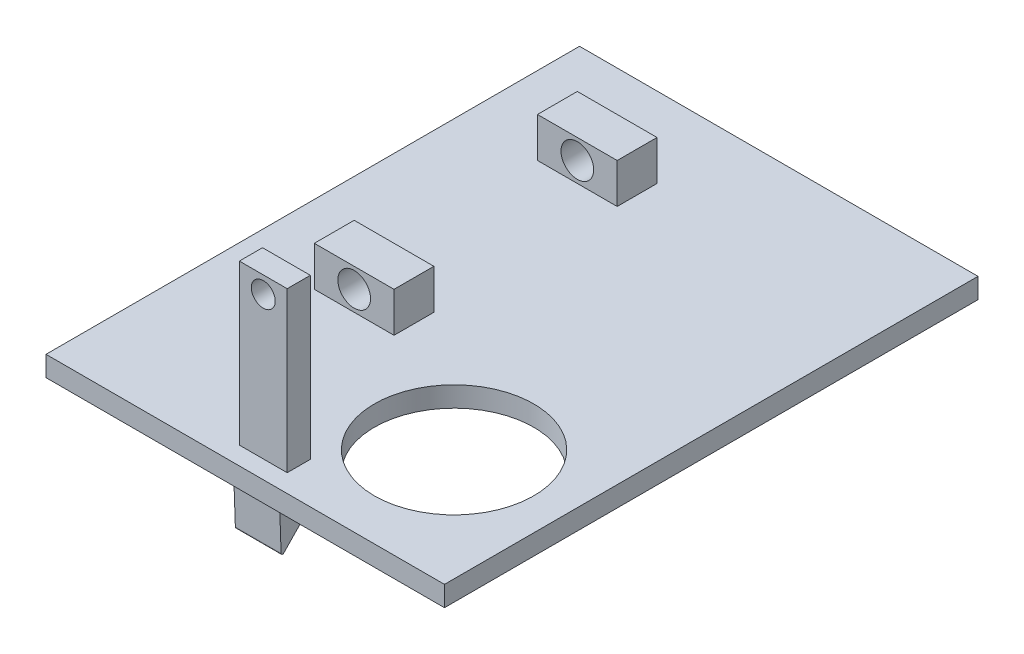
ISO-10303-21;
HEADER;
FILE_DESCRIPTION(('STEP AP214'),'2;1');
FILE_NAME('part.step','',(''),(''),'','','');
FILE_SCHEMA(('AUTOMOTIVE_DESIGN { 1 0 10303 214 1 1 1 1 }'));
ENDSEC;
DATA;
#1=APPLICATION_CONTEXT('core data for automotive mechanical design processes');
#2=APPLICATION_PROTOCOL_DEFINITION('international standard','automotive_design',2000,#1);
#3=PRODUCT_CONTEXT('',#1,'mechanical');
#4=PRODUCT('Part','Part','',(#3));
#5=PRODUCT_RELATED_PRODUCT_CATEGORY('part','',(#4));
#6=PRODUCT_DEFINITION_FORMATION('','',#4);
#7=PRODUCT_DEFINITION_CONTEXT('part definition',#1,'design');
#8=PRODUCT_DEFINITION('design','',#6,#7);
#9=PRODUCT_DEFINITION_SHAPE('','',#8);
#10=(LENGTH_UNIT() NAMED_UNIT(*) SI_UNIT(.MILLI.,.METRE.));
#11=(NAMED_UNIT(*) PLANE_ANGLE_UNIT() SI_UNIT($,.RADIAN.));
#12=(NAMED_UNIT(*) SI_UNIT($,.STERADIAN.) SOLID_ANGLE_UNIT());
#13=UNCERTAINTY_MEASURE_WITH_UNIT(LENGTH_MEASURE(1.E-05),#10,'distance_accuracy_value','');
#14=(GEOMETRIC_REPRESENTATION_CONTEXT(3) GLOBAL_UNCERTAINTY_ASSIGNED_CONTEXT((#13)) GLOBAL_UNIT_ASSIGNED_CONTEXT((#10,
#11,#12)) REPRESENTATION_CONTEXT('',''));
#15=CARTESIAN_POINT('',(0.,0.,0.));
#16=DIRECTION('',(0.,0.,1.));
#17=DIRECTION('',(1.,0.,0.));
#18=AXIS2_PLACEMENT_3D('',#15,#16,#17);
#19=CARTESIAN_POINT('',(0.,0.,0.));
#20=DIRECTION('',(0.,-1.,0.));
#21=DIRECTION('',(0.,0.,-1.));
#22=AXIS2_PLACEMENT_3D('',#19,#20,#21);
#23=PLANE('',#22);
#24=DIRECTION('',(1.,0.,0.));
#25=VECTOR('',#24,1.);
#26=CARTESIAN_POINT('',(352.767738438505,0.,507.988915644569));
#27=LINE('',#26,#25);
#28=CARTESIAN_POINT('',(352.767738438505,0.,507.988915644569));
#29=VERTEX_POINT('',#28);
#30=CARTESIAN_POINT('',(402.767738438505,0.,507.988915644569));
#31=VERTEX_POINT('',#30);
#32=EDGE_CURVE('E376',#29,#31,#27,.T.);
#33=ORIENTED_EDGE('',*,*,#32,.F.);
#34=DIRECTION('',(0.,0.,1.));
#35=VECTOR('',#34,1.);
#36=CARTESIAN_POINT('',(352.767738438505,0.,441.041767243454));
#37=LINE('',#36,#35);
#38=CARTESIAN_POINT('',(352.767738438505,0.,441.041767243454));
#39=VERTEX_POINT('',#38);
#40=EDGE_CURVE('E384',#39,#29,#37,.T.);
#41=ORIENTED_EDGE('',*,*,#40,.F.);
#42=DIRECTION('',(1.,0.,0.));
#43=VECTOR('',#42,1.);
#44=CARTESIAN_POINT('',(352.767738438505,0.,441.041767243454));
#45=LINE('',#44,#43);
#46=CARTESIAN_POINT('',(402.767738438505,0.,441.041767243454));
#47=VERTEX_POINT('',#46);
#48=EDGE_CURVE('E403',#39,#47,#45,.T.);
#49=ORIENTED_EDGE('',*,*,#48,.T.);
#50=DIRECTION('',(0.,0.,1.));
#51=VECTOR('',#50,1.);
#52=CARTESIAN_POINT('',(402.767738438505,0.,441.041767243454));
#53=LINE('',#52,#51);
#54=EDGE_CURVE('E399',#47,#31,#53,.T.);
#55=ORIENTED_EDGE('',*,*,#54,.T.);
#56=EDGE_LOOP('',(#33,#41,#49,#55));
#57=FACE_BOUND('',#56,.T.);
#58=CARTESIAN_POINT('',(388.753012650832,0.,492.770944419194));
#59=DIRECTION('',(0.,1.,0.));
#60=DIRECTION('',(0.,0.,1.));
#61=AXIS2_PLACEMENT_3D('',#58,#59,#60);
#62=CIRCLE('',#61,10.);
#63=CARTESIAN_POINT('',(388.753012650832,0.,502.770944419194));
#64=VERTEX_POINT('',#63);
#65=EDGE_CURVE('E371',#64,#64,#62,.T.);
#66=ORIENTED_EDGE('',*,*,#65,.T.);
#67=EDGE_LOOP('',(#66));
#68=FACE_BOUND('',#67,.T.);
#69=DIRECTION('',(-0.0174524064372835,0.,-0.999847695156391));
#70=VECTOR('',#69,1.);
#71=CARTESIAN_POINT('',(380.635017476005,0.,506.218399139157));
#72=LINE('',#71,#70);
#73=CARTESIAN_POINT('',(380.524825687469,0.,499.905515801907));
#74=VERTEX_POINT('',#73);
#75=CARTESIAN_POINT('',(380.641112918993,0.,506.567606834075));
#76=VERTEX_POINT('',#75);
#77=EDGE_CURVE('E434',#74,#76,#72,.F.);
#78=ORIENTED_EDGE('',*,*,#77,.F.);
#79=DIRECTION('',(-1.,0.,0.));
#80=VECTOR('',#79,1.);
#81=CARTESIAN_POINT('',(374.900459401004,0.,499.905515801907));
#82=LINE('',#81,#80);
#83=CARTESIAN_POINT('',(375.01065118954,0.,499.905515801907));
#84=VERTEX_POINT('',#83);
#85=EDGE_CURVE('E453',#74,#84,#82,.T.);
#86=ORIENTED_EDGE('',*,*,#85,.T.);
#87=DIRECTION('',(-0.0174524064372835,0.,0.999847695156391));
#88=VECTOR('',#87,1.);
#89=CARTESIAN_POINT('',(374.900459401004,0.,506.218399139157));
#90=LINE('',#89,#88);
#91=CARTESIAN_POINT('',(374.894363958016,0.,506.567606834075));
#92=VERTEX_POINT('',#91);
#93=EDGE_CURVE('E430',#92,#84,#90,.F.);
#94=ORIENTED_EDGE('',*,*,#93,.F.);
#95=DIRECTION('',(1.,0.,0.));
#96=VECTOR('',#95,1.);
#97=CARTESIAN_POINT('',(374.900459401004,0.,506.567606834075));
#98=LINE('',#97,#96);
#99=EDGE_CURVE('E438',#76,#92,#98,.F.);
#100=ORIENTED_EDGE('',*,*,#99,.F.);
#101=EDGE_LOOP('',(#78,#86,#94,#100));
#102=FACE_BOUND('',#101,.T.);
#103=ADVANCED_FACE('F103',(#57,#68,#102),#23,.T.);
#104=CARTESIAN_POINT('',(0.,2.54,0.));
#105=DIRECTION('',(0.,-1.,0.));
#106=DIRECTION('',(0.,0.,-1.));
#107=AXIS2_PLACEMENT_3D('',#104,#105,#106);
#108=PLANE('',#107);
#109=DIRECTION('',(0.,0.,1.));
#110=VECTOR('',#109,1.);
#111=CARTESIAN_POINT('',(362.539675888277,2.54,479.090375857973));
#112=LINE('',#111,#110);
#113=CARTESIAN_POINT('',(362.539675888277,2.54,479.090375857973));
#114=VERTEX_POINT('',#113);
#115=CARTESIAN_POINT('',(362.539675888277,2.54,484.090375857973));
#116=VERTEX_POINT('',#115);
#117=EDGE_CURVE('E335',#114,#116,#112,.T.);
#118=ORIENTED_EDGE('',*,*,#117,.F.);
#119=DIRECTION('',(1.,0.,0.));
#120=VECTOR('',#119,1.);
#121=CARTESIAN_POINT('',(362.539675888277,2.54,479.090375857973));
#122=LINE('',#121,#120);
#123=CARTESIAN_POINT('',(372.539675888278,2.54,479.090375857973));
#124=VERTEX_POINT('',#123);
#125=EDGE_CURVE('E354',#114,#124,#122,.T.);
#126=ORIENTED_EDGE('',*,*,#125,.T.);
#127=DIRECTION('',(0.,0.,1.));
#128=VECTOR('',#127,1.);
#129=CARTESIAN_POINT('',(372.539675888278,2.54,479.090375857973));
#130=LINE('',#129,#128);
#131=CARTESIAN_POINT('',(372.539675888278,2.54,484.090375857973));
#132=VERTEX_POINT('',#131);
#133=EDGE_CURVE('E351',#124,#132,#130,.T.);
#134=ORIENTED_EDGE('',*,*,#133,.T.);
#135=DIRECTION('',(1.,0.,0.));
#136=VECTOR('',#135,1.);
#137=CARTESIAN_POINT('',(362.539675888277,2.54,484.090375857973));
#138=LINE('',#137,#136);
#139=EDGE_CURVE('E347',#116,#132,#138,.T.);
#140=ORIENTED_EDGE('',*,*,#139,.F.);
#141=EDGE_LOOP('',(#118,#126,#134,#140));
#142=FACE_BOUND('',#141,.T.);
#143=CARTESIAN_POINT('',(388.753012650832,2.54,492.770944419194));
#144=DIRECTION('',(0.,1.,0.));
#145=DIRECTION('',(0.,0.,1.));
#146=AXIS2_PLACEMENT_3D('',#143,#144,#145);
#147=CIRCLE('',#146,10.);
#148=CARTESIAN_POINT('',(388.753012650832,2.54,502.770944419194));
#149=VERTEX_POINT('',#148);
#150=EDGE_CURVE('E372',#149,#149,#147,.T.);
#151=ORIENTED_EDGE('',*,*,#150,.F.);
#152=EDGE_LOOP('',(#151));
#153=FACE_BOUND('',#152,.T.);
#154=DIRECTION('',(1.,0.,0.));
#155=VECTOR('',#154,1.);
#156=CARTESIAN_POINT('',(352.767738438505,2.54,507.988915644569));
#157=LINE('',#156,#155);
#158=CARTESIAN_POINT('',(352.767738438505,2.54,507.988915644569));
#159=VERTEX_POINT('',#158);
#160=CARTESIAN_POINT('',(402.767738438505,2.54,507.988915644569));
#161=VERTEX_POINT('',#160);
#162=EDGE_CURVE('E380',#159,#161,#157,.T.);
#163=ORIENTED_EDGE('',*,*,#162,.T.);
#164=DIRECTION('',(0.,0.,1.));
#165=VECTOR('',#164,1.);
#166=CARTESIAN_POINT('',(402.767738438505,2.54,441.041767243454));
#167=LINE('',#166,#165);
#168=CARTESIAN_POINT('',(402.767738438505,2.54,441.041767243454));
#169=VERTEX_POINT('',#168);
#170=EDGE_CURVE('E383',#169,#161,#167,.T.);
#171=ORIENTED_EDGE('',*,*,#170,.F.);
#172=DIRECTION('',(1.,0.,0.));
#173=VECTOR('',#172,1.);
#174=CARTESIAN_POINT('',(352.767738438505,2.54,441.041767243454));
#175=LINE('',#174,#173);
#176=CARTESIAN_POINT('',(352.767738438505,2.54,441.041767243454));
#177=VERTEX_POINT('',#176);
#178=EDGE_CURVE('E388',#177,#169,#175,.T.);
#179=ORIENTED_EDGE('',*,*,#178,.F.);
#180=DIRECTION('',(0.,0.,1.));
#181=VECTOR('',#180,1.);
#182=CARTESIAN_POINT('',(352.767738438505,2.54,441.041767243454));
#183=LINE('',#182,#181);
#184=EDGE_CURVE('E392',#177,#159,#183,.T.);
#185=ORIENTED_EDGE('',*,*,#184,.T.);
#186=EDGE_LOOP('',(#163,#171,#179,#185));
#187=FACE_BOUND('',#186,.T.);
#188=DIRECTION('',(1.,0.,0.));
#189=VECTOR('',#188,1.);
#190=CARTESIAN_POINT('',(362.539675888277,2.54,456.090375857973));
#191=LINE('',#190,#189);
#192=CARTESIAN_POINT('',(362.539675888277,2.54,456.090375857973));
#193=VERTEX_POINT('',#192);
#194=CARTESIAN_POINT('',(372.539675888277,2.54,456.090375857973));
#195=VERTEX_POINT('',#194);
#196=EDGE_CURVE('E357',#193,#195,#191,.T.);
#197=ORIENTED_EDGE('',*,*,#196,.F.);
#198=DIRECTION('',(0.,0.,1.));
#199=VECTOR('',#198,1.);
#200=CARTESIAN_POINT('',(362.539675888277,2.54,451.090375857973));
#201=LINE('',#200,#199);
#202=CARTESIAN_POINT('',(362.539675888277,2.54,451.090375857973));
#203=VERTEX_POINT('',#202);
#204=EDGE_CURVE('E367',#203,#193,#201,.T.);
#205=ORIENTED_EDGE('',*,*,#204,.F.);
#206=DIRECTION('',(1.,0.,0.));
#207=VECTOR('',#206,1.);
#208=CARTESIAN_POINT('',(362.539675888277,2.54,451.090375857973));
#209=LINE('',#208,#207);
#210=CARTESIAN_POINT('',(372.539675888278,2.54,451.090375857973));
#211=VERTEX_POINT('',#210);
#212=EDGE_CURVE('E364',#203,#211,#209,.T.);
#213=ORIENTED_EDGE('',*,*,#212,.T.);
#214=DIRECTION('',(0.,0.,1.));
#215=VECTOR('',#214,1.);
#216=CARTESIAN_POINT('',(372.539675888278,2.54,451.090375857973));
#217=LINE('',#216,#215);
#218=EDGE_CURVE('E361',#211,#195,#217,.T.);
#219=ORIENTED_EDGE('',*,*,#218,.T.);
#220=EDGE_LOOP('',(#197,#205,#213,#219));
#221=FACE_BOUND('',#220,.T.);
#222=DIRECTION('',(0.,0.,1.));
#223=VECTOR('',#222,1.);
#224=CARTESIAN_POINT('',(374.767738438505,2.54,502.820910443291));
#225=LINE('',#224,#223);
#226=CARTESIAN_POINT('',(374.767738438505,2.54,502.820910443291));
#227=VERTEX_POINT('',#226);
#228=CARTESIAN_POINT('',(374.767738438505,2.54,505.725480778293));
#229=VERTEX_POINT('',#228);
#230=EDGE_CURVE('E266',#227,#229,#225,.T.);
#231=ORIENTED_EDGE('',*,*,#230,.F.);
#232=DIRECTION('',(-1.,0.,0.));
#233=VECTOR('',#232,1.);
#234=CARTESIAN_POINT('',(374.767738438505,2.54,502.820910443291));
#235=LINE('',#234,#233);
#236=CARTESIAN_POINT('',(380.767738438504,2.54,502.820910443291));
#237=VERTEX_POINT('',#236);
#238=EDGE_CURVE('E263',#237,#227,#235,.T.);
#239=ORIENTED_EDGE('',*,*,#238,.F.);
#240=DIRECTION('',(0.,0.,-1.));
#241=VECTOR('',#240,1.);
#242=CARTESIAN_POINT('',(380.767738438504,2.54,502.820910443291));
#243=LINE('',#242,#241);
#244=CARTESIAN_POINT('',(380.767738438504,2.54,505.725480778293));
#245=VERTEX_POINT('',#244);
#246=EDGE_CURVE('E787',#245,#237,#243,.T.);
#247=ORIENTED_EDGE('',*,*,#246,.F.);
#248=DIRECTION('',(1.,0.,0.));
#249=VECTOR('',#248,1.);
#250=CARTESIAN_POINT('',(374.767738438505,2.54,505.725480778293));
#251=LINE('',#250,#249);
#252=EDGE_CURVE('E779',#229,#245,#251,.T.);
#253=ORIENTED_EDGE('',*,*,#252,.F.);
#254=EDGE_LOOP('',(#231,#239,#247,#253));
#255=FACE_BOUND('',#254,.T.);
#256=ADVANCED_FACE('F483',(#142,#153,#187,#221,#255),#108,.F.);
#257=CARTESIAN_POINT('',(352.767738438505,2.54,507.988915644569));
#258=DIRECTION('',(0.,0.,-1.));
#259=DIRECTION('',(-1.,0.,0.));
#260=AXIS2_PLACEMENT_3D('',#257,#258,#259);
#261=PLANE('',#260);
#262=ORIENTED_EDGE('',*,*,#32,.T.);
#263=DIRECTION('',(0.,-1.,0.));
#264=VECTOR('',#263,1.);
#265=CARTESIAN_POINT('',(402.767738438505,2.54,507.988915644569));
#266=LINE('',#265,#264);
#267=EDGE_CURVE('E418',#161,#31,#266,.T.);
#268=ORIENTED_EDGE('',*,*,#267,.F.);
#269=ORIENTED_EDGE('',*,*,#162,.F.);
#270=DIRECTION('',(0.,-1.,0.));
#271=VECTOR('',#270,1.);
#272=CARTESIAN_POINT('',(352.767738438505,2.54,507.988915644569));
#273=LINE('',#272,#271);
#274=EDGE_CURVE('E395',#159,#29,#273,.T.);
#275=ORIENTED_EDGE('',*,*,#274,.T.);
#276=EDGE_LOOP('',(#262,#268,#269,#275));
#277=FACE_BOUND('',#276,.T.);
#278=ADVANCED_FACE('F489',(#277),#261,.F.);
#279=CARTESIAN_POINT('',(402.767738438505,2.54,441.041767243454));
#280=DIRECTION('',(1.,0.,0.));
#281=DIRECTION('',(0.,0.,-1.));
#282=AXIS2_PLACEMENT_3D('',#279,#280,#281);
#283=PLANE('',#282);
#284=ORIENTED_EDGE('',*,*,#54,.F.);
#285=DIRECTION('',(0.,-1.,0.));
#286=VECTOR('',#285,1.);
#287=CARTESIAN_POINT('',(402.767738438505,2.54,441.041767243454));
#288=LINE('',#287,#286);
#289=EDGE_CURVE('E415',#169,#47,#288,.T.);
#290=ORIENTED_EDGE('',*,*,#289,.F.);
#291=ORIENTED_EDGE('',*,*,#170,.T.);
#292=ORIENTED_EDGE('',*,*,#267,.T.);
#293=EDGE_LOOP('',(#284,#290,#291,#292));
#294=FACE_BOUND('',#293,.T.);
#295=ADVANCED_FACE('F504',(#294),#283,.T.);
#296=CARTESIAN_POINT('',(352.767738438505,2.54,441.041767243454));
#297=DIRECTION('',(0.,0.,-1.));
#298=DIRECTION('',(-1.,0.,0.));
#299=AXIS2_PLACEMENT_3D('',#296,#297,#298);
#300=PLANE('',#299);
#301=ORIENTED_EDGE('',*,*,#48,.F.);
#302=DIRECTION('',(0.,-1.,0.));
#303=VECTOR('',#302,1.);
#304=CARTESIAN_POINT('',(352.767738438505,2.54,441.041767243454));
#305=LINE('',#304,#303);
#306=EDGE_CURVE('E412',#177,#39,#305,.T.);
#307=ORIENTED_EDGE('',*,*,#306,.F.);
#308=ORIENTED_EDGE('',*,*,#178,.T.);
#309=ORIENTED_EDGE('',*,*,#289,.T.);
#310=EDGE_LOOP('',(#301,#307,#308,#309));
#311=FACE_BOUND('',#310,.T.);
#312=ADVANCED_FACE('F500',(#311),#300,.T.);
#313=CARTESIAN_POINT('',(352.767738438505,2.54,441.041767243454));
#314=DIRECTION('',(1.,0.,0.));
#315=DIRECTION('',(0.,0.,-1.));
#316=AXIS2_PLACEMENT_3D('',#313,#314,#315);
#317=PLANE('',#316);
#318=ORIENTED_EDGE('',*,*,#40,.T.);
#319=ORIENTED_EDGE('',*,*,#274,.F.);
#320=ORIENTED_EDGE('',*,*,#184,.F.);
#321=ORIENTED_EDGE('',*,*,#306,.T.);
#322=EDGE_LOOP('',(#318,#319,#320,#321));
#323=FACE_BOUND('',#322,.T.);
#324=ADVANCED_FACE('F496',(#323),#317,.F.);
#325=CARTESIAN_POINT('',(388.753012650832,2.54,492.770944419194));
#326=DIRECTION('',(0.,-1.,0.));
#327=DIRECTION('',(0.,0.,-1.));
#328=AXIS2_PLACEMENT_3D('',#325,#326,#327);
#329=CYLINDRICAL_SURFACE('',#328,10.);
#330=ORIENTED_EDGE('',*,*,#150,.T.);
#331=EDGE_LOOP('',(#330));
#332=FACE_BOUND('',#331,.T.);
#333=ORIENTED_EDGE('',*,*,#65,.F.);
#334=EDGE_LOOP('',(#333));
#335=FACE_BOUND('',#334,.T.);
#336=ADVANCED_FACE('F499',(#332,#335),#329,.F.);
#337=CARTESIAN_POINT('',(362.539675888277,0.,451.090375857973));
#338=DIRECTION('',(-1.,0.,0.));
#339=DIRECTION('',(0.,0.,1.));
#340=AXIS2_PLACEMENT_3D('',#337,#338,#339);
#341=PLANE('',#340);
#342=ORIENTED_EDGE('',*,*,#204,.T.);
#343=DIRECTION('',(0.,1.,0.));
#344=VECTOR('',#343,1.);
#345=CARTESIAN_POINT('',(362.539675888277,0.,456.090375857973));
#346=LINE('',#345,#344);
#347=CARTESIAN_POINT('',(362.539675888277,7.54,456.090375857973));
#348=VERTEX_POINT('',#347);
#349=EDGE_CURVE('E331',#193,#348,#346,.T.);
#350=ORIENTED_EDGE('',*,*,#349,.T.);
#351=DIRECTION('',(0.,0.,1.));
#352=VECTOR('',#351,1.);
#353=CARTESIAN_POINT('',(362.539675888277,7.54,451.090375857973));
#354=LINE('',#353,#352);
#355=CARTESIAN_POINT('',(362.539675888277,7.54,451.090375857973));
#356=VERTEX_POINT('',#355);
#357=EDGE_CURVE('E307',#356,#348,#354,.T.);
#358=ORIENTED_EDGE('',*,*,#357,.F.);
#359=DIRECTION('',(0.,1.,0.));
#360=VECTOR('',#359,1.);
#361=CARTESIAN_POINT('',(362.539675888277,0.,451.090375857973));
#362=LINE('',#361,#360);
#363=EDGE_CURVE('E332',#203,#356,#362,.T.);
#364=ORIENTED_EDGE('',*,*,#363,.F.);
#365=EDGE_LOOP('',(#342,#350,#358,#364));
#366=FACE_BOUND('',#365,.T.);
#367=ADVANCED_FACE('F721',(#366),#341,.T.);
#368=CARTESIAN_POINT('',(372.539675888277,0.,451.090375857973));
#369=DIRECTION('',(1.,0.,0.));
#370=DIRECTION('',(0.,0.,-1.));
#371=AXIS2_PLACEMENT_3D('',#368,#369,#370);
#372=PLANE('',#371);
#373=ORIENTED_EDGE('',*,*,#218,.F.);
#374=DIRECTION('',(0.,1.,0.));
#375=VECTOR('',#374,1.);
#376=CARTESIAN_POINT('',(372.539675888277,0.,451.090375857973));
#377=LINE('',#376,#375);
#378=CARTESIAN_POINT('',(372.539675888277,7.54,451.090375857973));
#379=VERTEX_POINT('',#378);
#380=EDGE_CURVE('E336',#211,#379,#377,.T.);
#381=ORIENTED_EDGE('',*,*,#380,.T.);
#382=DIRECTION('',(0.,0.,-1.));
#383=VECTOR('',#382,1.);
#384=CARTESIAN_POINT('',(372.539675888277,7.54,451.090375857973));
#385=LINE('',#384,#383);
#386=CARTESIAN_POINT('',(372.539675888277,7.54,456.090375857973));
#387=VERTEX_POINT('',#386);
#388=EDGE_CURVE('E323',#387,#379,#385,.T.);
#389=ORIENTED_EDGE('',*,*,#388,.F.);
#390=DIRECTION('',(0.,1.,0.));
#391=VECTOR('',#390,1.);
#392=CARTESIAN_POINT('',(372.539675888277,0.,456.090375857973));
#393=LINE('',#392,#391);
#394=EDGE_CURVE('E339',#195,#387,#393,.T.);
#395=ORIENTED_EDGE('',*,*,#394,.F.);
#396=EDGE_LOOP('',(#373,#381,#389,#395));
#397=FACE_BOUND('',#396,.T.);
#398=ADVANCED_FACE('F680',(#397),#372,.T.);
#399=CARTESIAN_POINT('',(362.539675888277,0.,451.090375857973));
#400=DIRECTION('',(0.,0.,-1.));
#401=DIRECTION('',(-1.,0.,0.));
#402=AXIS2_PLACEMENT_3D('',#399,#400,#401);
#403=PLANE('',#402);
#404=CARTESIAN_POINT('',(367.539675888278,5.04,451.090375857973));
#405=DIRECTION('',(0.,0.,-1.));
#406=DIRECTION('',(-1.,0.,0.));
#407=AXIS2_PLACEMENT_3D('',#404,#405,#406);
#408=CIRCLE('',#407,2.05000000000002);
#409=CARTESIAN_POINT('',(365.489675888278,5.04,451.090375857973));
#410=VERTEX_POINT('',#409);
#411=EDGE_CURVE('E268',#410,#410,#408,.T.);
#412=ORIENTED_EDGE('',*,*,#411,.F.);
#413=EDGE_LOOP('',(#412));
#414=FACE_BOUND('',#413,.T.);
#415=ORIENTED_EDGE('',*,*,#212,.F.);
#416=ORIENTED_EDGE('',*,*,#363,.T.);
#417=DIRECTION('',(-1.,0.,0.));
#418=VECTOR('',#417,1.);
#419=CARTESIAN_POINT('',(362.539675888277,7.54,451.090375857973));
#420=LINE('',#419,#418);
#421=EDGE_CURVE('E327',#379,#356,#420,.T.);
#422=ORIENTED_EDGE('',*,*,#421,.F.);
#423=ORIENTED_EDGE('',*,*,#380,.F.);
#424=EDGE_LOOP('',(#415,#416,#422,#423));
#425=FACE_BOUND('',#424,.T.);
#426=ADVANCED_FACE('F670',(#414,#425),#403,.T.);
#427=CARTESIAN_POINT('',(362.539675888277,0.,456.090375857973));
#428=DIRECTION('',(0.,0.,1.));
#429=DIRECTION('',(1.,0.,0.));
#430=AXIS2_PLACEMENT_3D('',#427,#428,#429);
#431=PLANE('',#430);
#432=CARTESIAN_POINT('',(367.539675888278,5.04,456.090375857973));
#433=DIRECTION('',(0.,0.,1.));
#434=DIRECTION('',(1.,0.,0.));
#435=AXIS2_PLACEMENT_3D('',#432,#433,#434);
#436=CIRCLE('',#435,2.05000000000002);
#437=CARTESIAN_POINT('',(365.489675888278,5.04,456.090375857973));
#438=VERTEX_POINT('',#437);
#439=EDGE_CURVE('E283',#438,#438,#436,.T.);
#440=ORIENTED_EDGE('',*,*,#439,.F.);
#441=EDGE_LOOP('',(#440));
#442=FACE_BOUND('',#441,.T.);
#443=ORIENTED_EDGE('',*,*,#196,.T.);
#444=ORIENTED_EDGE('',*,*,#394,.T.);
#445=DIRECTION('',(1.,0.,0.));
#446=VECTOR('',#445,1.);
#447=CARTESIAN_POINT('',(362.539675888277,7.54,456.090375857973));
#448=LINE('',#447,#446);
#449=EDGE_CURVE('E319',#348,#387,#448,.T.);
#450=ORIENTED_EDGE('',*,*,#449,.F.);
#451=ORIENTED_EDGE('',*,*,#349,.F.);
#452=EDGE_LOOP('',(#443,#444,#450,#451));
#453=FACE_BOUND('',#452,.T.);
#454=ADVANCED_FACE('F665',(#442,#453),#431,.T.);
#455=CARTESIAN_POINT('',(0.,7.54,0.));
#456=DIRECTION('',(0.,1.,0.));
#457=DIRECTION('',(0.,0.,1.));
#458=AXIS2_PLACEMENT_3D('',#455,#456,#457);
#459=PLANE('',#458);
#460=ORIENTED_EDGE('',*,*,#357,.T.);
#461=ORIENTED_EDGE('',*,*,#449,.T.);
#462=ORIENTED_EDGE('',*,*,#388,.T.);
#463=ORIENTED_EDGE('',*,*,#421,.T.);
#464=EDGE_LOOP('',(#460,#461,#462,#463));
#465=FACE_BOUND('',#464,.T.);
#466=ADVANCED_FACE('F657',(#465),#459,.T.);
#467=CARTESIAN_POINT('',(362.539675888277,0.,479.090375857973));
#468=DIRECTION('',(0.,0.,-1.));
#469=DIRECTION('',(-1.,0.,0.));
#470=AXIS2_PLACEMENT_3D('',#467,#468,#469);
#471=PLANE('',#470);
#472=CARTESIAN_POINT('',(367.539675888278,5.04,479.090375857973));
#473=DIRECTION('',(0.,0.,-1.));
#474=DIRECTION('',(-1.,0.,0.));
#475=AXIS2_PLACEMENT_3D('',#472,#473,#474);
#476=CIRCLE('',#475,2.05000000000002);
#477=CARTESIAN_POINT('',(365.489675888278,5.04,479.090375857973));
#478=VERTEX_POINT('',#477);
#479=EDGE_CURVE('E279',#478,#478,#476,.T.);
#480=ORIENTED_EDGE('',*,*,#479,.F.);
#481=EDGE_LOOP('',(#480));
#482=FACE_BOUND('',#481,.T.);
#483=ORIENTED_EDGE('',*,*,#125,.F.);
#484=DIRECTION('',(0.,1.,0.));
#485=VECTOR('',#484,1.);
#486=CARTESIAN_POINT('',(362.539675888277,0.,479.090375857973));
#487=LINE('',#486,#485);
#488=CARTESIAN_POINT('',(362.539675888277,7.54,479.090375857973));
#489=VERTEX_POINT('',#488);
#490=EDGE_CURVE('E304',#114,#489,#487,.T.);
#491=ORIENTED_EDGE('',*,*,#490,.T.);
#492=DIRECTION('',(-1.,0.,0.));
#493=VECTOR('',#492,1.);
#494=CARTESIAN_POINT('',(362.539675888277,7.54,479.090375857973));
#495=LINE('',#494,#493);
#496=CARTESIAN_POINT('',(372.539675888278,7.54,479.090375857973));
#497=VERTEX_POINT('',#496);
#498=EDGE_CURVE('E299',#497,#489,#495,.T.);
#499=ORIENTED_EDGE('',*,*,#498,.F.);
#500=DIRECTION('',(0.,1.,0.));
#501=VECTOR('',#500,1.);
#502=CARTESIAN_POINT('',(372.539675888278,0.,479.090375857973));
#503=LINE('',#502,#501);
#504=EDGE_CURVE('E308',#124,#497,#503,.T.);
#505=ORIENTED_EDGE('',*,*,#504,.F.);
#506=EDGE_LOOP('',(#483,#491,#499,#505));
#507=FACE_BOUND('',#506,.T.);
#508=ADVANCED_FACE('F645',(#482,#507),#471,.T.);
#509=CARTESIAN_POINT('',(362.539675888277,0.,484.090375857973));
#510=DIRECTION('',(0.,0.,1.));
#511=DIRECTION('',(1.,0.,0.));
#512=AXIS2_PLACEMENT_3D('',#509,#510,#511);
#513=PLANE('',#512);
#514=CARTESIAN_POINT('',(367.539675888278,5.04,484.090375857973));
#515=DIRECTION('',(0.,0.,1.));
#516=DIRECTION('',(1.,0.,0.));
#517=AXIS2_PLACEMENT_3D('',#514,#515,#516);
#518=CIRCLE('',#517,2.05000000000002);
#519=CARTESIAN_POINT('',(365.489675888278,5.04,484.090375857973));
#520=VERTEX_POINT('',#519);
#521=EDGE_CURVE('E273',#520,#520,#518,.T.);
#522=ORIENTED_EDGE('',*,*,#521,.F.);
#523=EDGE_LOOP('',(#522));
#524=FACE_BOUND('',#523,.T.);
#525=ORIENTED_EDGE('',*,*,#139,.T.);
#526=DIRECTION('',(0.,1.,0.));
#527=VECTOR('',#526,1.);
#528=CARTESIAN_POINT('',(372.539675888278,0.,484.090375857973));
#529=LINE('',#528,#527);
#530=CARTESIAN_POINT('',(372.539675888278,7.54,484.090375857973));
#531=VERTEX_POINT('',#530);
#532=EDGE_CURVE('E311',#132,#531,#529,.T.);
#533=ORIENTED_EDGE('',*,*,#532,.T.);
#534=DIRECTION('',(1.,0.,0.));
#535=VECTOR('',#534,1.);
#536=CARTESIAN_POINT('',(362.539675888277,7.54,484.090375857973));
#537=LINE('',#536,#535);
#538=CARTESIAN_POINT('',(362.539675888277,7.54,484.090375857973));
#539=VERTEX_POINT('',#538);
#540=EDGE_CURVE('E291',#539,#531,#537,.T.);
#541=ORIENTED_EDGE('',*,*,#540,.F.);
#542=DIRECTION('',(0.,1.,0.));
#543=VECTOR('',#542,1.);
#544=CARTESIAN_POINT('',(362.539675888277,0.,484.090375857973));
#545=LINE('',#544,#543);
#546=EDGE_CURVE('E303',#116,#539,#545,.T.);
#547=ORIENTED_EDGE('',*,*,#546,.F.);
#548=EDGE_LOOP('',(#525,#533,#541,#547));
#549=FACE_BOUND('',#548,.T.);
#550=ADVANCED_FACE('F639',(#524,#549),#513,.T.);
#551=CARTESIAN_POINT('',(362.539675888277,0.,479.090375857973));
#552=DIRECTION('',(-1.,0.,0.));
#553=DIRECTION('',(0.,0.,1.));
#554=AXIS2_PLACEMENT_3D('',#551,#552,#553);
#555=PLANE('',#554);
#556=ORIENTED_EDGE('',*,*,#117,.T.);
#557=ORIENTED_EDGE('',*,*,#546,.T.);
#558=DIRECTION('',(0.,0.,1.));
#559=VECTOR('',#558,1.);
#560=CARTESIAN_POINT('',(362.539675888277,7.54,479.090375857973));
#561=LINE('',#560,#559);
#562=EDGE_CURVE('E287',#489,#539,#561,.T.);
#563=ORIENTED_EDGE('',*,*,#562,.F.);
#564=ORIENTED_EDGE('',*,*,#490,.F.);
#565=EDGE_LOOP('',(#556,#557,#563,#564));
#566=FACE_BOUND('',#565,.T.);
#567=ADVANCED_FACE('F644',(#566),#555,.T.);
#568=CARTESIAN_POINT('',(372.539675888278,0.,479.090375857973));
#569=DIRECTION('',(1.,0.,0.));
#570=DIRECTION('',(0.,0.,-1.));
#571=AXIS2_PLACEMENT_3D('',#568,#569,#570);
#572=PLANE('',#571);
#573=ORIENTED_EDGE('',*,*,#133,.F.);
#574=ORIENTED_EDGE('',*,*,#504,.T.);
#575=DIRECTION('',(0.,0.,-1.));
#576=VECTOR('',#575,1.);
#577=CARTESIAN_POINT('',(372.539675888278,7.54,479.090375857973));
#578=LINE('',#577,#576);
#579=EDGE_CURVE('E295',#531,#497,#578,.T.);
#580=ORIENTED_EDGE('',*,*,#579,.F.);
#581=ORIENTED_EDGE('',*,*,#532,.F.);
#582=EDGE_LOOP('',(#573,#574,#580,#581));
#583=FACE_BOUND('',#582,.T.);
#584=ADVANCED_FACE('F690',(#583),#572,.T.);
#585=CARTESIAN_POINT('',(0.,7.54,0.));
#586=DIRECTION('',(0.,1.,0.));
#587=DIRECTION('',(0.,0.,1.));
#588=AXIS2_PLACEMENT_3D('',#585,#586,#587);
#589=PLANE('',#588);
#590=ORIENTED_EDGE('',*,*,#562,.T.);
#591=ORIENTED_EDGE('',*,*,#540,.T.);
#592=ORIENTED_EDGE('',*,*,#579,.T.);
#593=ORIENTED_EDGE('',*,*,#498,.T.);
#594=EDGE_LOOP('',(#590,#591,#592,#593));
#595=FACE_BOUND('',#594,.T.);
#596=ADVANCED_FACE('F632',(#595),#589,.T.);
#597=CARTESIAN_POINT('',(367.539675888278,5.04,492.090375857973));
#598=DIRECTION('',(0.,0.,-1.));
#599=DIRECTION('',(-1.,0.,0.));
#600=AXIS2_PLACEMENT_3D('',#597,#598,#599);
#601=CYLINDRICAL_SURFACE('',#600,2.05000000000002);
#602=CARTESIAN_POINT('',(365.489675888278,5.04,479.090375857973));
#603=CARTESIAN_POINT('',(365.489675888278,5.04,479.142459191307));
#604=CARTESIAN_POINT('',(365.489675888278,5.04,479.19454252464));
#605=CARTESIAN_POINT('',(365.489675888278,5.04,479.298709191307));
#606=CARTESIAN_POINT('',(365.489675888278,5.04,479.35079252464));
#607=CARTESIAN_POINT('',(365.489675888278,5.04,479.454959191307));
#608=CARTESIAN_POINT('',(365.489675888278,5.04,479.50704252464));
#609=CARTESIAN_POINT('',(365.489675888278,5.04,479.611209191307));
#610=CARTESIAN_POINT('',(365.489675888278,5.04,479.66329252464));
#611=CARTESIAN_POINT('',(365.489675888278,5.04,479.767459191307));
#612=CARTESIAN_POINT('',(365.489675888278,5.04,479.81954252464));
#613=CARTESIAN_POINT('',(365.489675888278,5.04,479.923709191307));
#614=CARTESIAN_POINT('',(365.489675888278,5.04,479.97579252464));
#615=CARTESIAN_POINT('',(365.489675888278,5.04,480.079959191307));
#616=CARTESIAN_POINT('',(365.489675888278,5.04,480.13204252464));
#617=CARTESIAN_POINT('',(365.489675888278,5.04,480.236209191307));
#618=CARTESIAN_POINT('',(365.489675888278,5.04,480.28829252464));
#619=CARTESIAN_POINT('',(365.489675888278,5.04,480.392459191307));
#620=CARTESIAN_POINT('',(365.489675888278,5.04,480.44454252464));
#621=CARTESIAN_POINT('',(365.489675888278,5.04,480.548709191307));
#622=CARTESIAN_POINT('',(365.489675888278,5.04,480.60079252464));
#623=CARTESIAN_POINT('',(365.489675888278,5.04,480.704959191307));
#624=CARTESIAN_POINT('',(365.489675888278,5.04,480.75704252464));
#625=CARTESIAN_POINT('',(365.489675888278,5.04,480.861209191307));
#626=CARTESIAN_POINT('',(365.489675888278,5.04,480.91329252464));
#627=CARTESIAN_POINT('',(365.489675888278,5.04,481.017459191307));
#628=CARTESIAN_POINT('',(365.489675888278,5.04,481.06954252464));
#629=CARTESIAN_POINT('',(365.489675888278,5.04,481.173709191307));
#630=CARTESIAN_POINT('',(365.489675888278,5.04,481.22579252464));
#631=CARTESIAN_POINT('',(365.489675888278,5.04,481.329959191307));
#632=CARTESIAN_POINT('',(365.489675888278,5.04,481.38204252464));
#633=CARTESIAN_POINT('',(365.489675888278,5.04,481.486209191307));
#634=CARTESIAN_POINT('',(365.489675888278,5.04,481.53829252464));
#635=CARTESIAN_POINT('',(365.489675888278,5.04,481.642459191307));
#636=CARTESIAN_POINT('',(365.489675888278,5.04,481.69454252464));
#637=CARTESIAN_POINT('',(365.489675888278,5.04,481.798709191307));
#638=CARTESIAN_POINT('',(365.489675888278,5.04,481.85079252464));
#639=CARTESIAN_POINT('',(365.489675888278,5.04,481.954959191307));
#640=CARTESIAN_POINT('',(365.489675888278,5.04,482.00704252464));
#641=CARTESIAN_POINT('',(365.489675888278,5.04,482.111209191307));
#642=CARTESIAN_POINT('',(365.489675888278,5.04,482.16329252464));
#643=CARTESIAN_POINT('',(365.489675888278,5.04,482.267459191307));
#644=CARTESIAN_POINT('',(365.489675888278,5.04,482.31954252464));
#645=CARTESIAN_POINT('',(365.489675888278,5.04,482.423709191307));
#646=CARTESIAN_POINT('',(365.489675888278,5.04,482.47579252464));
#647=CARTESIAN_POINT('',(365.489675888278,5.04,482.579959191307));
#648=CARTESIAN_POINT('',(365.489675888278,5.04,482.63204252464));
#649=CARTESIAN_POINT('',(365.489675888278,5.04,482.736209191307));
#650=CARTESIAN_POINT('',(365.489675888278,5.04,482.78829252464));
#651=CARTESIAN_POINT('',(365.489675888278,5.04,482.892459191307));
#652=CARTESIAN_POINT('',(365.489675888278,5.04,482.94454252464));
#653=CARTESIAN_POINT('',(365.489675888278,5.04,483.048709191307));
#654=CARTESIAN_POINT('',(365.489675888278,5.04,483.10079252464));
#655=CARTESIAN_POINT('',(365.489675888278,5.04,483.204959191307));
#656=CARTESIAN_POINT('',(365.489675888278,5.04,483.25704252464));
#657=CARTESIAN_POINT('',(365.489675888278,5.04,483.361209191307));
#658=CARTESIAN_POINT('',(365.489675888278,5.04,483.41329252464));
#659=CARTESIAN_POINT('',(365.489675888278,5.04,483.517459191307));
#660=CARTESIAN_POINT('',(365.489675888278,5.04,483.56954252464));
#661=CARTESIAN_POINT('',(365.489675888278,5.04,483.673709191307));
#662=CARTESIAN_POINT('',(365.489675888278,5.04,483.72579252464));
#663=CARTESIAN_POINT('',(365.489675888278,5.04,483.829959191307));
#664=CARTESIAN_POINT('',(365.489675888278,5.04,483.88204252464));
#665=CARTESIAN_POINT('',(365.489675888278,5.04,483.986209191307));
#666=CARTESIAN_POINT('',(365.489675888278,5.04,484.03829252464));
#667=CARTESIAN_POINT('',(365.489675888278,5.04,484.090375857973));
#668=B_SPLINE_CURVE_WITH_KNOTS('',3,(#602,#603,#604,#605,#606,#607,#608,#609,#610,#611,#612,
#613,#614,#615,#616,#617,#618,#619,#620,#621,#622,#623,#624,#625,#626,#627,#628,#629,#630,#631,
#632,#633,#634,#635,#636,#637,#638,#639,#640,#641,#642,#643,#644,#645,#646,#647,#648,#649,#650,
#651,#652,#653,#654,#655,#656,#657,#658,#659,#660,#661,#662,#663,#664,#665,#666,#667),
.UNSPECIFIED.,.F.,.F.,(4,2,2,2,2,2,2,2,2,2,2,2,2,2,2,2,2,2,2,2,2,2,2,2,2,2,2,2,2,2,2,2,4),(0.,
0.156249999999969,0.312499999999993,0.468749999999962,0.624999999999987,0.781249999999956,
0.93749999999998,1.09374999999995,1.24999999999997,1.40624999999994,1.56249999999997,
1.71874999999994,1.87499999999996,2.03124999999993,2.18749999999995,2.34374999999992,
2.49999999999995,2.65624999999997,2.81249999999994,2.96874999999996,3.12499999999993,
3.28124999999996,3.43749999999993,3.59374999999995,3.74999999999992,3.90624999999994,
4.06249999999991,4.21874999999994,4.37499999999991,4.53124999999993,4.6874999999999,
4.84374999999992,4.99999999999989),.UNSPECIFIED.);
#669=EDGE_CURVE('BSEAM622',#478,#520,#668,.T.);
#670=ORIENTED_EDGE('',*,*,#479,.T.);
#671=ORIENTED_EDGE('',*,*,#521,.T.);
#672=ORIENTED_EDGE('',*,*,#669,.T.);
#673=ORIENTED_EDGE('',*,*,#669,.F.);
#674=EDGE_LOOP('',(#670,#672,#671,#673));
#675=FACE_BOUND('',#674,.T.);
#676=ADVANCED_FACE('F622',(#675),#601,.F.);
#677=CARTESIAN_POINT('',(365.489675888278,5.04,456.090375857973));
#678=CARTESIAN_POINT('',(365.489675888278,5.04,456.03829252464));
#679=CARTESIAN_POINT('',(365.489675888278,5.04,455.986209191307));
#680=CARTESIAN_POINT('',(365.489675888278,5.04,455.88204252464));
#681=CARTESIAN_POINT('',(365.489675888278,5.04,455.829959191307));
#682=CARTESIAN_POINT('',(365.489675888278,5.04,455.72579252464));
#683=CARTESIAN_POINT('',(365.489675888278,5.04,455.673709191307));
#684=CARTESIAN_POINT('',(365.489675888278,5.04,455.56954252464));
#685=CARTESIAN_POINT('',(365.489675888278,5.04,455.517459191307));
#686=CARTESIAN_POINT('',(365.489675888278,5.04,455.41329252464));
#687=CARTESIAN_POINT('',(365.489675888278,5.04,455.361209191307));
#688=CARTESIAN_POINT('',(365.489675888278,5.04,455.25704252464));
#689=CARTESIAN_POINT('',(365.489675888278,5.04,455.204959191307));
#690=CARTESIAN_POINT('',(365.489675888278,5.04,455.10079252464));
#691=CARTESIAN_POINT('',(365.489675888278,5.04,455.048709191307));
#692=CARTESIAN_POINT('',(365.489675888278,5.04,454.94454252464));
#693=CARTESIAN_POINT('',(365.489675888278,5.04,454.892459191307));
#694=CARTESIAN_POINT('',(365.489675888278,5.04,454.78829252464));
#695=CARTESIAN_POINT('',(365.489675888278,5.04,454.736209191307));
#696=CARTESIAN_POINT('',(365.489675888278,5.04,454.63204252464));
#697=CARTESIAN_POINT('',(365.489675888278,5.04,454.579959191307));
#698=CARTESIAN_POINT('',(365.489675888278,5.04,454.47579252464));
#699=CARTESIAN_POINT('',(365.489675888278,5.04,454.423709191307));
#700=CARTESIAN_POINT('',(365.489675888278,5.04,454.31954252464));
#701=CARTESIAN_POINT('',(365.489675888278,5.04,454.267459191307));
#702=CARTESIAN_POINT('',(365.489675888278,5.04,454.16329252464));
#703=CARTESIAN_POINT('',(365.489675888278,5.04,454.111209191307));
#704=CARTESIAN_POINT('',(365.489675888278,5.04,454.00704252464));
#705=CARTESIAN_POINT('',(365.489675888278,5.04,453.954959191307));
#706=CARTESIAN_POINT('',(365.489675888278,5.04,453.85079252464));
#707=CARTESIAN_POINT('',(365.489675888278,5.04,453.798709191307));
#708=CARTESIAN_POINT('',(365.489675888278,5.04,453.69454252464));
#709=CARTESIAN_POINT('',(365.489675888278,5.04,453.642459191307));
#710=CARTESIAN_POINT('',(365.489675888278,5.04,453.53829252464));
#711=CARTESIAN_POINT('',(365.489675888278,5.04,453.486209191307));
#712=CARTESIAN_POINT('',(365.489675888278,5.04,453.38204252464));
#713=CARTESIAN_POINT('',(365.489675888278,5.04,453.329959191307));
#714=CARTESIAN_POINT('',(365.489675888278,5.04,453.22579252464));
#715=CARTESIAN_POINT('',(365.489675888278,5.04,453.173709191307));
#716=CARTESIAN_POINT('',(365.489675888278,5.04,453.06954252464));
#717=CARTESIAN_POINT('',(365.489675888278,5.04,453.017459191307));
#718=CARTESIAN_POINT('',(365.489675888278,5.04,452.91329252464));
#719=CARTESIAN_POINT('',(365.489675888278,5.04,452.861209191307));
#720=CARTESIAN_POINT('',(365.489675888278,5.04,452.75704252464));
#721=CARTESIAN_POINT('',(365.489675888278,5.04,452.704959191307));
#722=CARTESIAN_POINT('',(365.489675888278,5.04,452.60079252464));
#723=CARTESIAN_POINT('',(365.489675888278,5.04,452.548709191307));
#724=CARTESIAN_POINT('',(365.489675888278,5.04,452.44454252464));
#725=CARTESIAN_POINT('',(365.489675888278,5.04,452.392459191307));
#726=CARTESIAN_POINT('',(365.489675888278,5.04,452.28829252464));
#727=CARTESIAN_POINT('',(365.489675888278,5.04,452.236209191307));
#728=CARTESIAN_POINT('',(365.489675888278,5.04,452.13204252464));
#729=CARTESIAN_POINT('',(365.489675888278,5.04,452.079959191307));
#730=CARTESIAN_POINT('',(365.489675888278,5.04,451.97579252464));
#731=CARTESIAN_POINT('',(365.489675888278,5.04,451.923709191307));
#732=CARTESIAN_POINT('',(365.489675888278,5.04,451.81954252464));
#733=CARTESIAN_POINT('',(365.489675888278,5.04,451.767459191307));
#734=CARTESIAN_POINT('',(365.489675888278,5.04,451.66329252464));
#735=CARTESIAN_POINT('',(365.489675888278,5.04,451.611209191307));
#736=CARTESIAN_POINT('',(365.489675888278,5.04,451.50704252464));
#737=CARTESIAN_POINT('',(365.489675888278,5.04,451.454959191307));
#738=CARTESIAN_POINT('',(365.489675888278,5.04,451.35079252464));
#739=CARTESIAN_POINT('',(365.489675888278,5.04,451.298709191307));
#740=CARTESIAN_POINT('',(365.489675888278,5.04,451.19454252464));
#741=CARTESIAN_POINT('',(365.489675888278,5.04,451.142459191307));
#742=CARTESIAN_POINT('',(365.489675888278,5.04,451.090375857973));
#743=B_SPLINE_CURVE_WITH_KNOTS('',3,(#677,#678,#679,#680,#681,#682,#683,#684,#685,#686,#687,
#688,#689,#690,#691,#692,#693,#694,#695,#696,#697,#698,#699,#700,#701,#702,#703,#704,#705,#706,
#707,#708,#709,#710,#711,#712,#713,#714,#715,#716,#717,#718,#719,#720,#721,#722,#723,#724,#725,
#726,#727,#728,#729,#730,#731,#732,#733,#734,#735,#736,#737,#738,#739,#740,#741,#742),
.UNSPECIFIED.,.F.,.F.,(4,2,2,2,2,2,2,2,2,2,2,2,2,2,2,2,2,2,2,2,2,2,2,2,2,2,2,2,2,2,2,2,4),(0.,
0.156249999999969,0.312499999999993,0.468749999999962,0.624999999999987,0.781249999999956,
0.93749999999998,1.09374999999995,1.24999999999997,1.40624999999994,1.56249999999997,
1.71874999999994,1.87499999999996,2.03124999999993,2.18749999999995,2.34374999999992,
2.49999999999995,2.65624999999992,2.81249999999994,2.96874999999991,3.12499999999993,
3.2812499999999,3.43749999999993,3.5937499999999,3.74999999999992,3.90624999999989,
4.06249999999991,4.21874999999988,4.37499999999991,4.53124999999988,4.6874999999999,
4.84374999999987,4.99999999999989),.UNSPECIFIED.);
#744=EDGE_CURVE('BSEAM607',#438,#410,#743,.T.);
#745=ORIENTED_EDGE('',*,*,#439,.T.);
#746=ORIENTED_EDGE('',*,*,#411,.T.);
#747=ORIENTED_EDGE('',*,*,#744,.T.);
#748=ORIENTED_EDGE('',*,*,#744,.F.);
#749=EDGE_LOOP('',(#745,#747,#746,#748));
#750=FACE_BOUND('',#749,.T.);
#751=ADVANCED_FACE('F607',(#750),#601,.F.);
#752=CARTESIAN_POINT('',(374.767738438505,22.54,502.820910443291));
#753=DIRECTION('',(1.,0.,0.));
#754=DIRECTION('',(0.,0.,-1.));
#755=AXIS2_PLACEMENT_3D('',#752,#753,#754);
#756=PLANE('',#755);
#757=ORIENTED_EDGE('',*,*,#230,.T.);
#758=DIRECTION('',(0.,-1.,0.));
#759=VECTOR('',#758,1.);
#760=CARTESIAN_POINT('',(374.767738438505,22.54,505.725480778293));
#761=LINE('',#760,#759);
#762=CARTESIAN_POINT('',(374.767738438505,22.54,505.725480778293));
#763=VERTEX_POINT('',#762);
#764=EDGE_CURVE('E245',#763,#229,#761,.T.);
#765=ORIENTED_EDGE('',*,*,#764,.F.);
#766=DIRECTION('',(0.,0.,1.));
#767=VECTOR('',#766,1.);
#768=CARTESIAN_POINT('',(374.767738438505,22.54,502.820910443291));
#769=LINE('',#768,#767);
#770=CARTESIAN_POINT('',(374.767738438505,22.54,502.820910443291));
#771=VERTEX_POINT('',#770);
#772=EDGE_CURVE('E253',#771,#763,#769,.T.);
#773=ORIENTED_EDGE('',*,*,#772,.F.);
#774=DIRECTION('',(0.,-1.,0.));
#775=VECTOR('',#774,1.);
#776=CARTESIAN_POINT('',(374.767738438505,22.54,502.820910443291));
#777=LINE('',#776,#775);
#778=EDGE_CURVE('E784',#771,#227,#777,.T.);
#779=ORIENTED_EDGE('',*,*,#778,.T.);
#780=EDGE_LOOP('',(#757,#765,#773,#779));
#781=FACE_BOUND('',#780,.T.);
#782=ADVANCED_FACE('F265',(#781),#756,.F.);
#783=CARTESIAN_POINT('',(374.767738438505,22.54,505.725480778293));
#784=DIRECTION('',(0.,0.,-1.));
#785=DIRECTION('',(-1.,0.,0.));
#786=AXIS2_PLACEMENT_3D('',#783,#784,#785);
#787=PLANE('',#786);
#788=CARTESIAN_POINT('',(377.767738438505,20.4236456886687,505.725480778293));
#789=DIRECTION('',(0.,0.,1.));
#790=DIRECTION('',(1.,0.,0.));
#791=AXIS2_PLACEMENT_3D('',#788,#789,#790);
#792=CIRCLE('',#791,1.50000000000002);
#793=CARTESIAN_POINT('',(379.267738438505,20.4236456886687,505.725480778293));
#794=VERTEX_POINT('',#793);
#795=EDGE_CURVE('E429',#794,#794,#792,.T.);
#796=ORIENTED_EDGE('',*,*,#795,.F.);
#797=EDGE_LOOP('',(#796));
#798=FACE_BOUND('',#797,.T.);
#799=ORIENTED_EDGE('',*,*,#252,.T.);
#800=DIRECTION('',(0.,-1.,0.));
#801=VECTOR('',#800,1.);
#802=CARTESIAN_POINT('',(380.767738438504,22.54,505.725480778293));
#803=LINE('',#802,#801);
#804=CARTESIAN_POINT('',(380.767738438504,22.54,505.725480778293));
#805=VERTEX_POINT('',#804);
#806=EDGE_CURVE('E248',#805,#245,#803,.T.);
#807=ORIENTED_EDGE('',*,*,#806,.F.);
#808=DIRECTION('',(1.,0.,0.));
#809=VECTOR('',#808,1.);
#810=CARTESIAN_POINT('',(374.767738438505,22.54,505.725480778293));
#811=LINE('',#810,#809);
#812=EDGE_CURVE('E240',#763,#805,#811,.T.);
#813=ORIENTED_EDGE('',*,*,#812,.F.);
#814=ORIENTED_EDGE('',*,*,#764,.T.);
#815=EDGE_LOOP('',(#799,#807,#813,#814));
#816=FACE_BOUND('',#815,.T.);
#817=ADVANCED_FACE('F243',(#798,#816),#787,.F.);
#818=CARTESIAN_POINT('',(380.767738438504,22.54,502.820910443291));
#819=DIRECTION('',(-1.,0.,0.));
#820=DIRECTION('',(0.,0.,1.));
#821=AXIS2_PLACEMENT_3D('',#818,#819,#820);
#822=PLANE('',#821);
#823=ORIENTED_EDGE('',*,*,#246,.T.);
#824=DIRECTION('',(0.,-1.,0.));
#825=VECTOR('',#824,1.);
#826=CARTESIAN_POINT('',(380.767738438504,22.54,502.820910443291));
#827=LINE('',#826,#825);
#828=CARTESIAN_POINT('',(380.767738438504,22.54,502.820910443291));
#829=VERTEX_POINT('',#828);
#830=EDGE_CURVE('E275',#829,#237,#827,.T.);
#831=ORIENTED_EDGE('',*,*,#830,.F.);
#832=DIRECTION('',(0.,0.,-1.));
#833=VECTOR('',#832,1.);
#834=CARTESIAN_POINT('',(380.767738438504,22.54,502.820910443291));
#835=LINE('',#834,#833);
#836=EDGE_CURVE('E252',#805,#829,#835,.T.);
#837=ORIENTED_EDGE('',*,*,#836,.F.);
#838=ORIENTED_EDGE('',*,*,#806,.T.);
#839=EDGE_LOOP('',(#823,#831,#837,#838));
#840=FACE_BOUND('',#839,.T.);
#841=ADVANCED_FACE('F573',(#840),#822,.F.);
#842=CARTESIAN_POINT('',(374.767738438505,22.54,502.820910443291));
#843=DIRECTION('',(0.,0.,1.));
#844=DIRECTION('',(1.,0.,0.));
#845=AXIS2_PLACEMENT_3D('',#842,#843,#844);
#846=PLANE('',#845);
#847=CARTESIAN_POINT('',(377.767738438505,20.4236456886687,502.820910443291));
#848=DIRECTION('',(0.,0.,1.));
#849=DIRECTION('',(1.,0.,0.));
#850=AXIS2_PLACEMENT_3D('',#847,#848,#849);
#851=CIRCLE('',#850,1.50000000000002);
#852=CARTESIAN_POINT('',(379.267738438505,20.4236456886687,502.820910443291));
#853=VERTEX_POINT('',#852);
#854=EDGE_CURVE('E425',#853,#853,#851,.T.);
#855=ORIENTED_EDGE('',*,*,#854,.T.);
#856=EDGE_LOOP('',(#855));
#857=FACE_BOUND('',#856,.T.);
#858=ORIENTED_EDGE('',*,*,#238,.T.);
#859=ORIENTED_EDGE('',*,*,#778,.F.);
#860=DIRECTION('',(-1.,0.,0.));
#861=VECTOR('',#860,1.);
#862=CARTESIAN_POINT('',(374.767738438505,22.54,502.820910443291));
#863=LINE('',#862,#861);
#864=EDGE_CURVE('E258',#829,#771,#863,.T.);
#865=ORIENTED_EDGE('',*,*,#864,.F.);
#866=ORIENTED_EDGE('',*,*,#830,.T.);
#867=EDGE_LOOP('',(#858,#859,#865,#866));
#868=FACE_BOUND('',#867,.T.);
#869=ADVANCED_FACE('F568',(#857,#868),#846,.F.);
#870=CARTESIAN_POINT('',(0.,22.54,0.));
#871=DIRECTION('',(0.,1.,0.));
#872=DIRECTION('',(0.,0.,1.));
#873=AXIS2_PLACEMENT_3D('',#870,#871,#872);
#874=PLANE('',#873);
#875=ORIENTED_EDGE('',*,*,#772,.T.);
#876=ORIENTED_EDGE('',*,*,#812,.T.);
#877=ORIENTED_EDGE('',*,*,#836,.T.);
#878=ORIENTED_EDGE('',*,*,#864,.T.);
#879=EDGE_LOOP('',(#875,#876,#877,#878));
#880=FACE_BOUND('',#879,.T.);
#881=ADVANCED_FACE('F256',(#880),#874,.T.);
#882=CARTESIAN_POINT('',(377.767738438505,20.4236456886687,485.725480778293));
#883=DIRECTION('',(0.,0.,1.));
#884=DIRECTION('',(1.,0.,0.));
#885=AXIS2_PLACEMENT_3D('',#882,#883,#884);
#886=CYLINDRICAL_SURFACE('',#885,1.50000000000002);
#887=ORIENTED_EDGE('',*,*,#795,.T.);
#888=EDGE_LOOP('',(#887));
#889=FACE_BOUND('',#888,.T.);
#890=ORIENTED_EDGE('',*,*,#854,.F.);
#891=EDGE_LOOP('',(#890));
#892=FACE_BOUND('',#891,.T.);
#893=ADVANCED_FACE('F514',(#889,#892),#886,.F.);
#894=CARTESIAN_POINT('',(374.900459401004,-10.,506.218399139157));
#895=DIRECTION('',(-0.999847695156391,0.,-0.0174524064372835));
#896=DIRECTION('',(-0.0174524064372835,0.,0.999847695156391));
#897=AXIS2_PLACEMENT_3D('',#894,#895,#896);
#898=PLANE('',#897);
#899=DIRECTION('',(0.0123416547509368,0.707052927141243,-0.707052927141249));
#900=VECTOR('',#899,1.);
#901=CARTESIAN_POINT('',(374.834967172062,-10.0649306204507,509.970446422358));
#902=LINE('',#901,#900);
#903=CARTESIAN_POINT('',(374.90396497984,-6.11204886028071,506.017564662188));
#904=VERTEX_POINT('',#903);
#905=EDGE_CURVE('E450',#84,#904,#902,.F.);
#906=ORIENTED_EDGE('',*,*,#905,.T.);
#907=CARTESIAN_POINT('',(374.901496460884,-5.97062750404336,506.158986018425));
#908=DIRECTION('',(-0.999847695156391,0.,-0.0174524064372835));
#909=DIRECTION('',(0.0174524064372835,0.,-0.999847695156391));
#910=AXIS2_PLACEMENT_3D('',#907,#908,#909);
#911=ELLIPSE('',#910,0.200030465608782,0.2);
#912=CARTESIAN_POINT('',(374.898007574529,-5.97760740338386,506.358864183829));
#913=VERTEX_POINT('',#912);
#914=EDGE_CURVE('E12',#904,#913,#911,.T.);
#915=ORIENTED_EDGE('',*,*,#914,.T.);
#916=DIRECTION('',(-0.000609172867874779,0.999390641586316,0.0348994902270457));
#917=VECTOR('',#916,1.);
#918=CARTESIAN_POINT('',(374.900459401004,-10.,506.218399139157));
#919=LINE('',#918,#917);
#920=EDGE_CURVE('E442',#913,#92,#919,.T.);
#921=ORIENTED_EDGE('',*,*,#920,.T.);
#922=ORIENTED_EDGE('',*,*,#93,.T.);
#923=EDGE_LOOP('',(#906,#915,#921,#922));
#924=FACE_BOUND('',#923,.T.);
#925=ADVANCED_FACE('F475',(#924),#898,.T.);
#926=CARTESIAN_POINT('',(380.635017476005,-10.,506.218399139157));
#927=DIRECTION('',(0.999847695156391,0.,-0.0174524064372835));
#928=DIRECTION('',(-0.0174524064372835,0.,-0.999847695156391));
#929=AXIS2_PLACEMENT_3D('',#926,#927,#928);
#930=PLANE('',#929);
#931=DIRECTION('',(0.000609172867874779,0.999390641586316,0.0348994902270457));
#932=VECTOR('',#931,1.);
#933=CARTESIAN_POINT('',(380.635015347958,-10.0034912084941,506.21827722347));
#934=LINE('',#933,#932);
#935=CARTESIAN_POINT('',(380.63746930248,-5.97760740338386,506.358864183829));
#936=VERTEX_POINT('',#935);
#937=EDGE_CURVE('E443',#936,#76,#934,.T.);
#938=ORIENTED_EDGE('',*,*,#937,.F.);
#939=CARTESIAN_POINT('',(380.633980416125,-5.97062750404336,506.158986018425));
#940=DIRECTION('',(0.999847695156391,0.,-0.0174524064372835));
#941=DIRECTION('',(0.0174524064372835,0.,0.999847695156391));
#942=AXIS2_PLACEMENT_3D('',#939,#940,#941);
#943=ELLIPSE('',#942,0.200030465608782,0.2);
#944=CARTESIAN_POINT('',(380.631511897169,-6.11204886028072,506.017564662188));
#945=VERTEX_POINT('',#944);
#946=EDGE_CURVE('E126',#936,#945,#943,.T.);
#947=ORIENTED_EDGE('',*,*,#946,.T.);
#948=DIRECTION('',(0.0123416547509368,-0.707052927141243,0.707052927141249));
#949=VECTOR('',#948,1.);
#950=CARTESIAN_POINT('',(380.699636237464,-10.0148897018997,509.920405503807));
#951=LINE('',#950,#949);
#952=EDGE_CURVE('E421',#945,#74,#951,.F.);
#953=ORIENTED_EDGE('',*,*,#952,.T.);
#954=ORIENTED_EDGE('',*,*,#77,.T.);
#955=EDGE_LOOP('',(#938,#947,#953,#954));
#956=FACE_BOUND('',#955,.T.);
#957=ADVANCED_FACE('F468',(#956),#930,.T.);
#958=CARTESIAN_POINT('',(374.900459401004,-10.,506.218399139157));
#959=DIRECTION('',(0.,-0.034899496702501,0.999390827019096));
#960=DIRECTION('',(0.,-0.999390827019096,-0.034899496702501));
#961=AXIS2_PLACEMENT_3D('',#958,#959,#960);
#962=PLANE('',#961);
#963=ORIENTED_EDGE('',*,*,#920,.F.);
#964=DIRECTION('',(1.,0.,0.));
#965=VECTOR('',#964,1.);
#966=CARTESIAN_POINT('',(380.637189102091,-5.97760740338386,506.358864183829));
#967=LINE('',#966,#965);
#968=EDGE_CURVE('E456',#913,#936,#967,.T.);
#969=ORIENTED_EDGE('',*,*,#968,.T.);
#970=ORIENTED_EDGE('',*,*,#937,.T.);
#971=ORIENTED_EDGE('',*,*,#99,.T.);
#972=EDGE_LOOP('',(#963,#969,#970,#971));
#973=FACE_BOUND('',#972,.T.);
#974=ADVANCED_FACE('F465',(#973),#962,.T.);
#975=CARTESIAN_POINT('',(374.900459401004,-10.065502206005,509.971018007912));
#976=DIRECTION('',(0.,-0.707106781186551,-0.707106781186545));
#977=DIRECTION('',(-1.,0.,0.));
#978=AXIS2_PLACEMENT_3D('',#975,#976,#977);
#979=PLANE('',#978);
#980=ORIENTED_EDGE('',*,*,#952,.F.);
#981=DIRECTION('',(-1.,0.,0.));
#982=VECTOR('',#981,1.);
#983=CARTESIAN_POINT('',(374.898287774917,-6.11204886028069,506.017564662188));
#984=LINE('',#983,#982);
#985=EDGE_CURVE('E112',#945,#904,#984,.T.);
#986=ORIENTED_EDGE('',*,*,#985,.T.);
#987=ORIENTED_EDGE('',*,*,#905,.F.);
#988=ORIENTED_EDGE('',*,*,#85,.F.);
#989=EDGE_LOOP('',(#980,#986,#987,#988));
#990=FACE_BOUND('',#989,.T.);
#991=ADVANCED_FACE('F476',(#990),#979,.T.);
#992=CARTESIAN_POINT('',(374.900459401004,-5.97062750404336,506.158986018425));
#993=DIRECTION('',(1.,0.,0.));
#994=DIRECTION('',(0.,0.,-1.));
#995=AXIS2_PLACEMENT_3D('',#992,#993,#994);
#996=CYLINDRICAL_SURFACE('',#995,0.2);
#997=ORIENTED_EDGE('',*,*,#914,.F.);
#998=ORIENTED_EDGE('',*,*,#985,.F.);
#999=ORIENTED_EDGE('',*,*,#946,.F.);
#1000=ORIENTED_EDGE('',*,*,#968,.F.);
#1001=EDGE_LOOP('',(#997,#998,#999,#1000));
#1002=FACE_BOUND('',#1001,.T.);
#1003=ADVANCED_FACE('F105',(#1002),#996,.T.);
#1004=CLOSED_SHELL('',(#103,#256,#278,#295,#312,#324,#336,#367,#398,#426,#454,#466,#508,#550,
#567,#584,#596,#676,#751,#782,#817,#841,#869,#881,#893,#925,#957,#974,#991,#1003));
#1005=MANIFOLD_SOLID_BREP('B2',#1004);
#1006=ADVANCED_BREP_SHAPE_REPRESENTATION('',(#18,#1005),#14);
#1007=SHAPE_DEFINITION_REPRESENTATION(#9,#1006);
ENDSEC;
END-ISO-10303-21;
